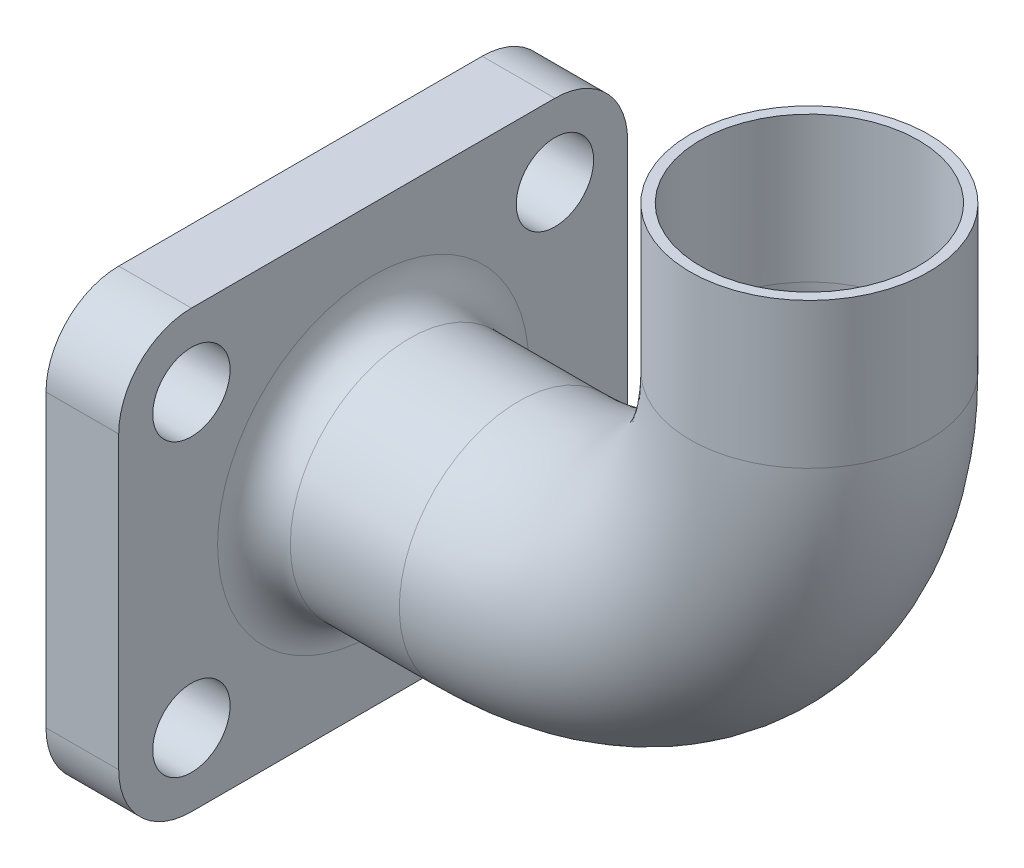
ISO-10303-21;
HEADER;
FILE_DESCRIPTION(('STEP AP214'),'2;1');
FILE_NAME('part.step','',(''),(''),'','','');
FILE_SCHEMA(('AUTOMOTIVE_DESIGN { 1 0 10303 214 1 1 1 1 }'));
ENDSEC;
DATA;
#1=APPLICATION_CONTEXT('core data for automotive mechanical design processes');
#2=APPLICATION_PROTOCOL_DEFINITION('international standard','automotive_design',2000,#1);
#3=PRODUCT_CONTEXT('',#1,'mechanical');
#4=PRODUCT('Part','Part','',(#3));
#5=PRODUCT_RELATED_PRODUCT_CATEGORY('part','',(#4));
#6=PRODUCT_DEFINITION_FORMATION('','',#4);
#7=PRODUCT_DEFINITION_CONTEXT('part definition',#1,'design');
#8=PRODUCT_DEFINITION('design','',#6,#7);
#9=PRODUCT_DEFINITION_SHAPE('','',#8);
#10=(LENGTH_UNIT() NAMED_UNIT(*) SI_UNIT(.MILLI.,.METRE.));
#11=(NAMED_UNIT(*) PLANE_ANGLE_UNIT() SI_UNIT($,.RADIAN.));
#12=(NAMED_UNIT(*) SI_UNIT($,.STERADIAN.) SOLID_ANGLE_UNIT());
#13=UNCERTAINTY_MEASURE_WITH_UNIT(LENGTH_MEASURE(1.E-05),#10,'distance_accuracy_value','');
#14=(GEOMETRIC_REPRESENTATION_CONTEXT(3) GLOBAL_UNCERTAINTY_ASSIGNED_CONTEXT((#13)) GLOBAL_UNIT_ASSIGNED_CONTEXT((#10,
#11,#12)) REPRESENTATION_CONTEXT('',''));
#15=CARTESIAN_POINT('',(0.,0.,0.));
#16=DIRECTION('',(0.,0.,1.));
#17=DIRECTION('',(1.,0.,0.));
#18=AXIS2_PLACEMENT_3D('',#15,#16,#17);
#19=CARTESIAN_POINT('',(6.35,-12.7,15.875));
#20=DIRECTION('',(-1.,0.,0.));
#21=DIRECTION('',(0.,0.,1.));
#22=AXIS2_PLACEMENT_3D('',#19,#20,#21);
#23=PLANE('',#22);
#24=CARTESIAN_POINT('',(6.35,-12.7,15.875));
#25=DIRECTION('',(1.,0.,0.));
#26=DIRECTION('',(0.,0.,-1.));
#27=AXIS2_PLACEMENT_3D('',#24,#25,#26);
#28=CIRCLE('',#27,3.37819999999999);
#29=CARTESIAN_POINT('',(6.35,-12.7,12.4968));
#30=VERTEX_POINT('',#29);
#31=EDGE_CURVE('E167',#30,#30,#28,.T.);
#32=ORIENTED_EDGE('',*,*,#31,.F.);
#33=EDGE_LOOP('',(#32));
#34=FACE_BOUND('',#33,.T.);
#35=CARTESIAN_POINT('',(6.35,0.,0.));
#36=DIRECTION('',(-1.,0.,0.));
#37=DIRECTION('',(0.,0.,1.));
#38=AXIS2_PLACEMENT_3D('',#35,#36,#37);
#39=CIRCLE('',#38,13.589);
#40=CARTESIAN_POINT('',(6.35,0.,13.589));
#41=VERTEX_POINT('',#40);
#42=EDGE_CURVE('E11',#41,#41,#39,.T.);
#43=ORIENTED_EDGE('',*,*,#42,.T.);
#44=EDGE_LOOP('',(#43));
#45=FACE_BOUND('',#44,.T.);
#46=CARTESIAN_POINT('',(6.35,-12.7,15.875));
#47=DIRECTION('',(1.,0.,0.));
#48=DIRECTION('',(0.,0.,1.));
#49=AXIS2_PLACEMENT_3D('',#46,#47,#48);
#50=CIRCLE('',#49,6.35);
#51=CARTESIAN_POINT('',(6.35,-12.7,22.225));
#52=VERTEX_POINT('',#51);
#53=CARTESIAN_POINT('',(6.35,-19.05,15.875));
#54=VERTEX_POINT('',#53);
#55=EDGE_CURVE('E149',#52,#54,#50,.T.);
#56=ORIENTED_EDGE('',*,*,#55,.T.);
#57=DIRECTION('',(0.,0.,-1.));
#58=VECTOR('',#57,1.);
#59=CARTESIAN_POINT('',(6.35,-19.05,15.875));
#60=LINE('',#59,#58);
#61=CARTESIAN_POINT('',(6.35,-19.05,-15.875));
#62=VERTEX_POINT('',#61);
#63=EDGE_CURVE('E97',#54,#62,#60,.T.);
#64=ORIENTED_EDGE('',*,*,#63,.T.);
#65=CARTESIAN_POINT('',(6.35,-12.7,-15.875));
#66=DIRECTION('',(1.,0.,0.));
#67=DIRECTION('',(0.,0.,-1.));
#68=AXIS2_PLACEMENT_3D('',#65,#66,#67);
#69=CIRCLE('',#68,6.35);
#70=CARTESIAN_POINT('',(6.35,-12.7,-22.225));
#71=VERTEX_POINT('',#70);
#72=EDGE_CURVE('E214',#62,#71,#69,.T.);
#73=ORIENTED_EDGE('',*,*,#72,.T.);
#74=DIRECTION('',(0.,1.,0.));
#75=VECTOR('',#74,1.);
#76=CARTESIAN_POINT('',(6.35,-12.7,-22.225));
#77=LINE('',#76,#75);
#78=CARTESIAN_POINT('',(6.35,12.7,-22.225));
#79=VERTEX_POINT('',#78);
#80=EDGE_CURVE('E216',#71,#79,#77,.T.);
#81=ORIENTED_EDGE('',*,*,#80,.T.);
#82=CARTESIAN_POINT('',(6.35,12.7,-15.875));
#83=DIRECTION('',(1.,0.,0.));
#84=DIRECTION('',(0.,0.,1.));
#85=AXIS2_PLACEMENT_3D('',#82,#83,#84);
#86=CIRCLE('',#85,6.35);
#87=CARTESIAN_POINT('',(6.35,19.05,-15.875));
#88=VERTEX_POINT('',#87);
#89=EDGE_CURVE('E116',#79,#88,#86,.T.);
#90=ORIENTED_EDGE('',*,*,#89,.T.);
#91=DIRECTION('',(0.,0.,1.));
#92=VECTOR('',#91,1.);
#93=CARTESIAN_POINT('',(6.35,19.05,15.875));
#94=LINE('',#93,#92);
#95=CARTESIAN_POINT('',(6.35,19.05,15.875));
#96=VERTEX_POINT('',#95);
#97=EDGE_CURVE('E110',#88,#96,#94,.T.);
#98=ORIENTED_EDGE('',*,*,#97,.T.);
#99=CARTESIAN_POINT('',(6.35,12.7,15.875));
#100=DIRECTION('',(1.,0.,0.));
#101=DIRECTION('',(0.,0.,1.));
#102=AXIS2_PLACEMENT_3D('',#99,#100,#101);
#103=CIRCLE('',#102,6.35);
#104=CARTESIAN_POINT('',(6.35,12.7,22.225));
#105=VERTEX_POINT('',#104);
#106=EDGE_CURVE('E114',#96,#105,#103,.T.);
#107=ORIENTED_EDGE('',*,*,#106,.T.);
#108=DIRECTION('',(0.,-1.,0.));
#109=VECTOR('',#108,1.);
#110=CARTESIAN_POINT('',(6.35,-12.7,22.225));
#111=LINE('',#110,#109);
#112=EDGE_CURVE('E53',#105,#52,#111,.T.);
#113=ORIENTED_EDGE('',*,*,#112,.T.);
#114=EDGE_LOOP('',(#56,#64,#73,#81,#90,#98,#107,#113));
#115=FACE_BOUND('',#114,.T.);
#116=CARTESIAN_POINT('',(6.35,-12.7,-15.875));
#117=DIRECTION('',(1.,0.,0.));
#118=DIRECTION('',(0.,0.,-1.));
#119=AXIS2_PLACEMENT_3D('',#116,#117,#118);
#120=CIRCLE('',#119,3.37819999999999);
#121=CARTESIAN_POINT('',(6.35,-12.7,-19.2532));
#122=VERTEX_POINT('',#121);
#123=EDGE_CURVE('E168',#122,#122,#120,.T.);
#124=ORIENTED_EDGE('',*,*,#123,.F.);
#125=EDGE_LOOP('',(#124));
#126=FACE_BOUND('',#125,.T.);
#127=CARTESIAN_POINT('',(6.35,12.7,-15.875));
#128=DIRECTION('',(1.,0.,0.));
#129=DIRECTION('',(0.,0.,-1.));
#130=AXIS2_PLACEMENT_3D('',#127,#128,#129);
#131=CIRCLE('',#130,3.37819999999999);
#132=CARTESIAN_POINT('',(6.35,12.7,-19.2532));
#133=VERTEX_POINT('',#132);
#134=EDGE_CURVE('E180',#133,#133,#131,.T.);
#135=ORIENTED_EDGE('',*,*,#134,.F.);
#136=EDGE_LOOP('',(#135));
#137=FACE_BOUND('',#136,.T.);
#138=CARTESIAN_POINT('',(6.35,12.7,15.875));
#139=DIRECTION('',(1.,0.,0.));
#140=DIRECTION('',(0.,0.,-1.));
#141=AXIS2_PLACEMENT_3D('',#138,#139,#140);
#142=CIRCLE('',#141,3.37819999999999);
#143=CARTESIAN_POINT('',(6.35,12.7,12.4968));
#144=VERTEX_POINT('',#143);
#145=EDGE_CURVE('E311',#144,#144,#142,.T.);
#146=ORIENTED_EDGE('',*,*,#145,.F.);
#147=EDGE_LOOP('',(#146));
#148=FACE_BOUND('',#147,.T.);
#149=ADVANCED_FACE('F34',(#34,#45,#115,#126,#137,#148),#23,.F.);
#150=CARTESIAN_POINT('',(0.,-12.7,15.875));
#151=DIRECTION('',(-1.,0.,0.));
#152=DIRECTION('',(0.,0.,1.));
#153=AXIS2_PLACEMENT_3D('',#150,#151,#152);
#154=PLANE('',#153);
#155=CARTESIAN_POINT('',(0.,12.7,15.875));
#156=DIRECTION('',(-1.,0.,0.));
#157=DIRECTION('',(0.,0.,1.));
#158=AXIS2_PLACEMENT_3D('',#155,#156,#157);
#159=CIRCLE('',#158,3.37819999999999);
#160=CARTESIAN_POINT('',(0.,12.7,19.2532));
#161=VERTEX_POINT('',#160);
#162=EDGE_CURVE('E38',#161,#161,#159,.T.);
#163=ORIENTED_EDGE('',*,*,#162,.F.);
#164=EDGE_LOOP('',(#163));
#165=FACE_BOUND('',#164,.T.);
#166=CARTESIAN_POINT('',(0.,12.7,-15.875));
#167=DIRECTION('',(-1.,0.,0.));
#168=DIRECTION('',(0.,0.,1.));
#169=AXIS2_PLACEMENT_3D('',#166,#167,#168);
#170=CIRCLE('',#169,3.37819999999999);
#171=CARTESIAN_POINT('',(0.,12.7,-12.4968));
#172=VERTEX_POINT('',#171);
#173=EDGE_CURVE('E175',#172,#172,#170,.T.);
#174=ORIENTED_EDGE('',*,*,#173,.F.);
#175=EDGE_LOOP('',(#174));
#176=FACE_BOUND('',#175,.T.);
#177=CARTESIAN_POINT('',(0.,-12.7,-15.875));
#178=DIRECTION('',(-1.,0.,0.));
#179=DIRECTION('',(0.,0.,1.));
#180=AXIS2_PLACEMENT_3D('',#177,#178,#179);
#181=CIRCLE('',#180,3.37819999999999);
#182=CARTESIAN_POINT('',(0.,-12.7,-12.4968));
#183=VERTEX_POINT('',#182);
#184=EDGE_CURVE('E165',#183,#183,#181,.T.);
#185=ORIENTED_EDGE('',*,*,#184,.F.);
#186=EDGE_LOOP('',(#185));
#187=FACE_BOUND('',#186,.T.);
#188=CARTESIAN_POINT('',(0.,-12.7,15.875));
#189=DIRECTION('',(-1.,0.,0.));
#190=DIRECTION('',(0.,0.,1.));
#191=AXIS2_PLACEMENT_3D('',#188,#189,#190);
#192=CIRCLE('',#191,3.37819999999999);
#193=CARTESIAN_POINT('',(0.,-12.7,19.2532));
#194=VERTEX_POINT('',#193);
#195=EDGE_CURVE('E172',#194,#194,#192,.T.);
#196=ORIENTED_EDGE('',*,*,#195,.F.);
#197=EDGE_LOOP('',(#196));
#198=FACE_BOUND('',#197,.T.);
#199=CARTESIAN_POINT('',(0.,-12.7,15.875));
#200=DIRECTION('',(1.,0.,0.));
#201=DIRECTION('',(0.,0.,1.));
#202=AXIS2_PLACEMENT_3D('',#199,#200,#201);
#203=CIRCLE('',#202,6.35);
#204=CARTESIAN_POINT('',(0.,-12.7,22.225));
#205=VERTEX_POINT('',#204);
#206=CARTESIAN_POINT('',(0.,-19.05,15.875));
#207=VERTEX_POINT('',#206);
#208=EDGE_CURVE('E134',#205,#207,#203,.T.);
#209=ORIENTED_EDGE('',*,*,#208,.F.);
#210=DIRECTION('',(0.,-1.,0.));
#211=VECTOR('',#210,1.);
#212=CARTESIAN_POINT('',(0.,-12.7,22.225));
#213=LINE('',#212,#211);
#214=CARTESIAN_POINT('',(0.,12.7,22.225));
#215=VERTEX_POINT('',#214);
#216=EDGE_CURVE('E88',#215,#205,#213,.T.);
#217=ORIENTED_EDGE('',*,*,#216,.F.);
#218=CARTESIAN_POINT('',(0.,12.7,15.875));
#219=DIRECTION('',(1.,0.,0.));
#220=DIRECTION('',(0.,0.,1.));
#221=AXIS2_PLACEMENT_3D('',#218,#219,#220);
#222=CIRCLE('',#221,6.35);
#223=CARTESIAN_POINT('',(0.,19.05,15.875));
#224=VERTEX_POINT('',#223);
#225=EDGE_CURVE('E82',#224,#215,#222,.T.);
#226=ORIENTED_EDGE('',*,*,#225,.F.);
#227=DIRECTION('',(0.,0.,1.));
#228=VECTOR('',#227,1.);
#229=CARTESIAN_POINT('',(0.,19.05,15.875));
#230=LINE('',#229,#228);
#231=CARTESIAN_POINT('',(0.,19.05,-15.875));
#232=VERTEX_POINT('',#231);
#233=EDGE_CURVE('E124',#232,#224,#230,.T.);
#234=ORIENTED_EDGE('',*,*,#233,.F.);
#235=CARTESIAN_POINT('',(0.,12.7,-15.875));
#236=DIRECTION('',(1.,0.,0.));
#237=DIRECTION('',(0.,0.,1.));
#238=AXIS2_PLACEMENT_3D('',#235,#236,#237);
#239=CIRCLE('',#238,6.35);
#240=CARTESIAN_POINT('',(0.,12.7,-22.225));
#241=VERTEX_POINT('',#240);
#242=EDGE_CURVE('E144',#241,#232,#239,.T.);
#243=ORIENTED_EDGE('',*,*,#242,.F.);
#244=DIRECTION('',(0.,1.,0.));
#245=VECTOR('',#244,1.);
#246=CARTESIAN_POINT('',(0.,-12.7,-22.225));
#247=LINE('',#246,#245);
#248=CARTESIAN_POINT('',(0.,-12.7,-22.225));
#249=VERTEX_POINT('',#248);
#250=EDGE_CURVE('E142',#249,#241,#247,.T.);
#251=ORIENTED_EDGE('',*,*,#250,.F.);
#252=CARTESIAN_POINT('',(0.,-12.7,-15.875));
#253=DIRECTION('',(1.,0.,0.));
#254=DIRECTION('',(0.,0.,-1.));
#255=AXIS2_PLACEMENT_3D('',#252,#253,#254);
#256=CIRCLE('',#255,6.35);
#257=CARTESIAN_POINT('',(0.,-19.05,-15.875));
#258=VERTEX_POINT('',#257);
#259=EDGE_CURVE('E140',#258,#249,#256,.T.);
#260=ORIENTED_EDGE('',*,*,#259,.F.);
#261=DIRECTION('',(0.,0.,-1.));
#262=VECTOR('',#261,1.);
#263=CARTESIAN_POINT('',(0.,-19.05,15.875));
#264=LINE('',#263,#262);
#265=EDGE_CURVE('E137',#207,#258,#264,.T.);
#266=ORIENTED_EDGE('',*,*,#265,.F.);
#267=EDGE_LOOP('',(#209,#217,#226,#234,#243,#251,#260,#266));
#268=FACE_BOUND('',#267,.T.);
#269=CARTESIAN_POINT('',(0.,0.,0.));
#270=DIRECTION('',(-1.,0.,0.));
#271=DIRECTION('',(0.,0.,1.));
#272=AXIS2_PLACEMENT_3D('',#269,#270,#271);
#273=CIRCLE('',#272,12.7);
#274=CARTESIAN_POINT('',(0.,0.,12.7));
#275=VERTEX_POINT('',#274);
#276=EDGE_CURVE('E189',#275,#275,#273,.T.);
#277=ORIENTED_EDGE('',*,*,#276,.F.);
#278=EDGE_LOOP('',(#277));
#279=FACE_BOUND('',#278,.T.);
#280=ADVANCED_FACE('F229',(#165,#176,#187,#198,#268,#279),#154,.T.);
#281=CARTESIAN_POINT('',(6.35,-12.7,15.875));
#282=DIRECTION('',(-1.,0.,0.));
#283=DIRECTION('',(0.,0.,1.));
#284=AXIS2_PLACEMENT_3D('',#281,#282,#283);
#285=CYLINDRICAL_SURFACE('',#284,6.35);
#286=ORIENTED_EDGE('',*,*,#208,.T.);
#287=DIRECTION('',(-1.,0.,0.));
#288=VECTOR('',#287,1.);
#289=CARTESIAN_POINT('',(6.35,-19.05,15.875));
#290=LINE('',#289,#288);
#291=EDGE_CURVE('E162',#54,#207,#290,.T.);
#292=ORIENTED_EDGE('',*,*,#291,.F.);
#293=ORIENTED_EDGE('',*,*,#55,.F.);
#294=DIRECTION('',(-1.,0.,0.));
#295=VECTOR('',#294,1.);
#296=CARTESIAN_POINT('',(6.35,-12.7,22.225));
#297=LINE('',#296,#295);
#298=EDGE_CURVE('E130',#52,#205,#297,.T.);
#299=ORIENTED_EDGE('',*,*,#298,.T.);
#300=EDGE_LOOP('',(#286,#292,#293,#299));
#301=FACE_BOUND('',#300,.T.);
#302=ADVANCED_FACE('F234',(#301),#285,.T.);
#303=CARTESIAN_POINT('',(6.35,-19.05,15.875));
#304=DIRECTION('',(0.,1.,0.));
#305=DIRECTION('',(0.,0.,1.));
#306=AXIS2_PLACEMENT_3D('',#303,#304,#305);
#307=PLANE('',#306);
#308=ORIENTED_EDGE('',*,*,#265,.T.);
#309=DIRECTION('',(-1.,0.,0.));
#310=VECTOR('',#309,1.);
#311=CARTESIAN_POINT('',(6.35,-19.05,-15.875));
#312=LINE('',#311,#310);
#313=EDGE_CURVE('E159',#62,#258,#312,.T.);
#314=ORIENTED_EDGE('',*,*,#313,.F.);
#315=ORIENTED_EDGE('',*,*,#63,.F.);
#316=ORIENTED_EDGE('',*,*,#291,.T.);
#317=EDGE_LOOP('',(#308,#314,#315,#316));
#318=FACE_BOUND('',#317,.T.);
#319=ADVANCED_FACE('F414',(#318),#307,.F.);
#320=CARTESIAN_POINT('',(6.35,-12.7,-15.875));
#321=DIRECTION('',(-1.,0.,0.));
#322=DIRECTION('',(0.,0.,1.));
#323=AXIS2_PLACEMENT_3D('',#320,#321,#322);
#324=CYLINDRICAL_SURFACE('',#323,6.35);
#325=ORIENTED_EDGE('',*,*,#259,.T.);
#326=DIRECTION('',(-1.,0.,0.));
#327=VECTOR('',#326,1.);
#328=CARTESIAN_POINT('',(6.35,-12.7,-22.225));
#329=LINE('',#328,#327);
#330=EDGE_CURVE('E156',#71,#249,#329,.T.);
#331=ORIENTED_EDGE('',*,*,#330,.F.);
#332=ORIENTED_EDGE('',*,*,#72,.F.);
#333=ORIENTED_EDGE('',*,*,#313,.T.);
#334=EDGE_LOOP('',(#325,#331,#332,#333));
#335=FACE_BOUND('',#334,.T.);
#336=ADVANCED_FACE('F420',(#335),#324,.T.);
#337=CARTESIAN_POINT('',(6.35,-12.7,-22.225));
#338=DIRECTION('',(0.,0.,1.));
#339=DIRECTION('',(1.,0.,0.));
#340=AXIS2_PLACEMENT_3D('',#337,#338,#339);
#341=PLANE('',#340);
#342=ORIENTED_EDGE('',*,*,#250,.T.);
#343=DIRECTION('',(-1.,0.,0.));
#344=VECTOR('',#343,1.);
#345=CARTESIAN_POINT('',(6.35,12.7,-22.225));
#346=LINE('',#345,#344);
#347=EDGE_CURVE('E153',#79,#241,#346,.T.);
#348=ORIENTED_EDGE('',*,*,#347,.F.);
#349=ORIENTED_EDGE('',*,*,#80,.F.);
#350=ORIENTED_EDGE('',*,*,#330,.T.);
#351=EDGE_LOOP('',(#342,#348,#349,#350));
#352=FACE_BOUND('',#351,.T.);
#353=ADVANCED_FACE('F222',(#352),#341,.F.);
#354=CARTESIAN_POINT('',(6.35,12.7,-15.875));
#355=DIRECTION('',(-1.,0.,0.));
#356=DIRECTION('',(0.,0.,1.));
#357=AXIS2_PLACEMENT_3D('',#354,#355,#356);
#358=CYLINDRICAL_SURFACE('',#357,6.35);
#359=ORIENTED_EDGE('',*,*,#242,.T.);
#360=DIRECTION('',(-1.,0.,0.));
#361=VECTOR('',#360,1.);
#362=CARTESIAN_POINT('',(6.35,19.05,-15.875));
#363=LINE('',#362,#361);
#364=EDGE_CURVE('E125',#88,#232,#363,.T.);
#365=ORIENTED_EDGE('',*,*,#364,.F.);
#366=ORIENTED_EDGE('',*,*,#89,.F.);
#367=ORIENTED_EDGE('',*,*,#347,.T.);
#368=EDGE_LOOP('',(#359,#365,#366,#367));
#369=FACE_BOUND('',#368,.T.);
#370=ADVANCED_FACE('F226',(#369),#358,.T.);
#371=CARTESIAN_POINT('',(6.35,19.05,15.875));
#372=DIRECTION('',(0.,-1.,0.));
#373=DIRECTION('',(0.,0.,-1.));
#374=AXIS2_PLACEMENT_3D('',#371,#372,#373);
#375=PLANE('',#374);
#376=ORIENTED_EDGE('',*,*,#233,.T.);
#377=DIRECTION('',(-1.,0.,0.));
#378=VECTOR('',#377,1.);
#379=CARTESIAN_POINT('',(6.35,19.05,15.875));
#380=LINE('',#379,#378);
#381=EDGE_CURVE('E121',#96,#224,#380,.T.);
#382=ORIENTED_EDGE('',*,*,#381,.F.);
#383=ORIENTED_EDGE('',*,*,#97,.F.);
#384=ORIENTED_EDGE('',*,*,#364,.T.);
#385=EDGE_LOOP('',(#376,#382,#383,#384));
#386=FACE_BOUND('',#385,.T.);
#387=ADVANCED_FACE('F122',(#386),#375,.F.);
#388=CARTESIAN_POINT('',(6.35,12.7,15.875));
#389=DIRECTION('',(-1.,0.,0.));
#390=DIRECTION('',(0.,0.,1.));
#391=AXIS2_PLACEMENT_3D('',#388,#389,#390);
#392=CYLINDRICAL_SURFACE('',#391,6.35);
#393=ORIENTED_EDGE('',*,*,#225,.T.);
#394=DIRECTION('',(-1.,0.,0.));
#395=VECTOR('',#394,1.);
#396=CARTESIAN_POINT('',(6.35,12.7,22.225));
#397=LINE('',#396,#395);
#398=EDGE_CURVE('E126',#105,#215,#397,.T.);
#399=ORIENTED_EDGE('',*,*,#398,.F.);
#400=ORIENTED_EDGE('',*,*,#106,.F.);
#401=ORIENTED_EDGE('',*,*,#381,.T.);
#402=EDGE_LOOP('',(#393,#399,#400,#401));
#403=FACE_BOUND('',#402,.T.);
#404=ADVANCED_FACE('F128',(#403),#392,.T.);
#405=CARTESIAN_POINT('',(6.35,-12.7,22.225));
#406=DIRECTION('',(0.,0.,-1.));
#407=DIRECTION('',(-1.,0.,0.));
#408=AXIS2_PLACEMENT_3D('',#405,#406,#407);
#409=PLANE('',#408);
#410=ORIENTED_EDGE('',*,*,#216,.T.);
#411=ORIENTED_EDGE('',*,*,#298,.F.);
#412=ORIENTED_EDGE('',*,*,#112,.F.);
#413=ORIENTED_EDGE('',*,*,#398,.T.);
#414=EDGE_LOOP('',(#410,#411,#412,#413));
#415=FACE_BOUND('',#414,.T.);
#416=ADVANCED_FACE('F236',(#415),#409,.F.);
#417=CARTESIAN_POINT('',(6.35,0.,0.));
#418=DIRECTION('',(-1.,0.,0.));
#419=DIRECTION('',(0.,0.,1.));
#420=AXIS2_PLACEMENT_3D('',#417,#418,#419);
#421=CYLINDRICAL_SURFACE('',#420,9.525);
#422=CARTESIAN_POINT('',(19.05,0.,0.));
#423=DIRECTION('',(1.,0.,0.));
#424=DIRECTION('',(0.,0.,-1.));
#425=AXIS2_PLACEMENT_3D('',#422,#423,#424);
#426=CIRCLE('',#425,9.525);
#427=CARTESIAN_POINT('',(19.05,-9.52500000000001,0.));
#428=VERTEX_POINT('',#427);
#429=EDGE_CURVE('E193',#428,#428,#426,.T.);
#430=ORIENTED_EDGE('',*,*,#429,.T.);
#431=EDGE_LOOP('',(#430));
#432=FACE_BOUND('',#431,.T.);
#433=CARTESIAN_POINT('',(-2.921,0.,0.));
#434=DIRECTION('',(-1.,0.,0.));
#435=DIRECTION('',(0.,0.,1.));
#436=AXIS2_PLACEMENT_3D('',#433,#434,#435);
#437=CIRCLE('',#436,9.525);
#438=CARTESIAN_POINT('',(-2.921,0.,9.525));
#439=VERTEX_POINT('',#438);
#440=EDGE_CURVE('E186',#439,#439,#437,.T.);
#441=ORIENTED_EDGE('',*,*,#440,.T.);
#442=EDGE_LOOP('',(#441));
#443=FACE_BOUND('',#442,.T.);
#444=ADVANCED_FACE('F238',(#432,#443),#421,.F.);
#445=CARTESIAN_POINT('',(44.45,25.4,0.));
#446=DIRECTION('',(0.,1.,0.));
#447=DIRECTION('',(-1.,0.,0.));
#448=AXIS2_PLACEMENT_3D('',#445,#446,#447);
#449=CYLINDRICAL_SURFACE('',#448,10.414);
#450=CARTESIAN_POINT('',(44.45,25.4,0.));
#451=DIRECTION('',(0.,1.,0.));
#452=DIRECTION('',(-1.,0.,0.));
#453=AXIS2_PLACEMENT_3D('',#450,#451,#452);
#454=CIRCLE('',#453,10.414);
#455=CARTESIAN_POINT('',(54.864,25.4,0.));
#456=VERTEX_POINT('',#455);
#457=EDGE_CURVE('E205',#456,#456,#454,.T.);
#458=ORIENTED_EDGE('',*,*,#457,.T.);
#459=EDGE_LOOP('',(#458));
#460=FACE_BOUND('',#459,.T.);
#461=CARTESIAN_POINT('',(44.45,38.1,0.));
#462=DIRECTION('',(0.,1.,0.));
#463=DIRECTION('',(-1.,0.,0.));
#464=AXIS2_PLACEMENT_3D('',#461,#462,#463);
#465=CIRCLE('',#464,10.414);
#466=CARTESIAN_POINT('',(34.036,38.1,0.));
#467=VERTEX_POINT('',#466);
#468=EDGE_CURVE('E138',#467,#467,#465,.T.);
#469=ORIENTED_EDGE('',*,*,#468,.F.);
#470=EDGE_LOOP('',(#469));
#471=FACE_BOUND('',#470,.T.);
#472=ADVANCED_FACE('F244',(#460,#471),#449,.T.);
#473=CARTESIAN_POINT('',(19.05,25.4,0.));
#474=DIRECTION('',(0.,0.,1.));
#475=DIRECTION('',(1.,0.,0.));
#476=AXIS2_PLACEMENT_3D('',#473,#474,#475);
#477=TOROIDAL_SURFACE('',#476,25.4,10.414);
#478=CARTESIAN_POINT('',(19.05,0.,0.));
#479=DIRECTION('',(-1.,0.,0.));
#480=DIRECTION('',(0.,-1.,0.));
#481=AXIS2_PLACEMENT_3D('',#478,#479,#480);
#482=CIRCLE('',#481,10.414);
#483=CARTESIAN_POINT('',(19.05,-10.414,0.));
#484=VERTEX_POINT('',#483);
#485=EDGE_CURVE('E204',#484,#484,#482,.F.);
#486=CARTESIAN_POINT('',(19.05,25.4,0.));
#487=DIRECTION('',(0.,0.,1.));
#488=DIRECTION('',(1.,0.,0.));
#489=AXIS2_PLACEMENT_3D('',#486,#487,#488);
#490=CIRCLE('',#489,35.814);
#491=EDGE_CURVE('',#484,#456,#490,.T.);
#492=ORIENTED_EDGE('',*,*,#485,.T.);
#493=ORIENTED_EDGE('',*,*,#457,.F.);
#494=ORIENTED_EDGE('',*,*,#491,.T.);
#495=ORIENTED_EDGE('',*,*,#491,.F.);
#496=EDGE_LOOP('',(#492,#494,#493,#495));
#497=FACE_BOUND('',#496,.T.);
#498=ADVANCED_FACE('F263',(#497),#477,.T.);
#499=CARTESIAN_POINT('',(19.05,0.,0.));
#500=DIRECTION('',(-1.,0.,0.));
#501=DIRECTION('',(0.,-1.,0.));
#502=AXIS2_PLACEMENT_3D('',#499,#500,#501);
#503=CYLINDRICAL_SURFACE('',#502,10.414);
#504=CARTESIAN_POINT('',(9.525,0.,0.));
#505=DIRECTION('',(-1.,0.,0.));
#506=DIRECTION('',(0.,0.,1.));
#507=AXIS2_PLACEMENT_3D('',#504,#505,#506);
#508=CIRCLE('',#507,10.414);
#509=CARTESIAN_POINT('',(9.525,-10.414,0.));
#510=VERTEX_POINT('',#509);
#511=EDGE_CURVE('E44',#510,#510,#508,.F.);
#512=CARTESIAN_POINT('',(9.525,-10.414,0.));
#513=CARTESIAN_POINT('',(9.62421875,-10.414,0.));
#514=CARTESIAN_POINT('',(9.7234375,-10.414,0.));
#515=CARTESIAN_POINT('',(9.921875,-10.414,0.));
#516=CARTESIAN_POINT('',(10.02109375,-10.414,0.));
#517=CARTESIAN_POINT('',(10.21953125,-10.414,0.));
#518=CARTESIAN_POINT('',(10.31875,-10.414,0.));
#519=CARTESIAN_POINT('',(10.5171875,-10.414,0.));
#520=CARTESIAN_POINT('',(10.61640625,-10.414,0.));
#521=CARTESIAN_POINT('',(10.81484375,-10.414,0.));
#522=CARTESIAN_POINT('',(10.9140625,-10.414,0.));
#523=CARTESIAN_POINT('',(11.1125,-10.414,0.));
#524=CARTESIAN_POINT('',(11.21171875,-10.414,0.));
#525=CARTESIAN_POINT('',(11.41015625,-10.414,0.));
#526=CARTESIAN_POINT('',(11.509375,-10.414,0.));
#527=CARTESIAN_POINT('',(11.7078125,-10.414,0.));
#528=CARTESIAN_POINT('',(11.80703125,-10.414,0.));
#529=CARTESIAN_POINT('',(12.00546875,-10.414,0.));
#530=CARTESIAN_POINT('',(12.1046875,-10.414,0.));
#531=CARTESIAN_POINT('',(12.303125,-10.414,0.));
#532=CARTESIAN_POINT('',(12.40234375,-10.414,0.));
#533=CARTESIAN_POINT('',(12.60078125,-10.414,0.));
#534=CARTESIAN_POINT('',(12.7,-10.414,0.));
#535=CARTESIAN_POINT('',(12.8984375,-10.414,0.));
#536=CARTESIAN_POINT('',(12.99765625,-10.414,0.));
#537=CARTESIAN_POINT('',(13.19609375,-10.414,0.));
#538=CARTESIAN_POINT('',(13.2953125,-10.414,0.));
#539=CARTESIAN_POINT('',(13.49375,-10.414,0.));
#540=CARTESIAN_POINT('',(13.59296875,-10.414,0.));
#541=CARTESIAN_POINT('',(13.79140625,-10.414,0.));
#542=CARTESIAN_POINT('',(13.890625,-10.414,0.));
#543=CARTESIAN_POINT('',(14.0890625,-10.414,0.));
#544=CARTESIAN_POINT('',(14.18828125,-10.414,0.));
#545=CARTESIAN_POINT('',(14.38671875,-10.414,0.));
#546=CARTESIAN_POINT('',(14.4859375,-10.414,0.));
#547=CARTESIAN_POINT('',(14.684375,-10.414,0.));
#548=CARTESIAN_POINT('',(14.78359375,-10.414,0.));
#549=CARTESIAN_POINT('',(14.98203125,-10.414,0.));
#550=CARTESIAN_POINT('',(15.08125,-10.414,0.));
#551=CARTESIAN_POINT('',(15.2796875,-10.414,0.));
#552=CARTESIAN_POINT('',(15.37890625,-10.414,0.));
#553=CARTESIAN_POINT('',(15.57734375,-10.414,0.));
#554=CARTESIAN_POINT('',(15.6765625,-10.414,0.));
#555=CARTESIAN_POINT('',(15.875,-10.414,0.));
#556=CARTESIAN_POINT('',(15.97421875,-10.414,0.));
#557=CARTESIAN_POINT('',(16.17265625,-10.414,0.));
#558=CARTESIAN_POINT('',(16.271875,-10.414,0.));
#559=CARTESIAN_POINT('',(16.4703125,-10.414,0.));
#560=CARTESIAN_POINT('',(16.56953125,-10.414,0.));
#561=CARTESIAN_POINT('',(16.76796875,-10.414,0.));
#562=CARTESIAN_POINT('',(16.8671875,-10.414,0.));
#563=CARTESIAN_POINT('',(17.065625,-10.414,0.));
#564=CARTESIAN_POINT('',(17.16484375,-10.414,0.));
#565=CARTESIAN_POINT('',(17.36328125,-10.414,0.));
#566=CARTESIAN_POINT('',(17.4625,-10.414,0.));
#567=CARTESIAN_POINT('',(17.6609375,-10.414,0.));
#568=CARTESIAN_POINT('',(17.76015625,-10.414,0.));
#569=CARTESIAN_POINT('',(17.95859375,-10.414,0.));
#570=CARTESIAN_POINT('',(18.0578125,-10.414,0.));
#571=CARTESIAN_POINT('',(18.25625,-10.414,0.));
#572=CARTESIAN_POINT('',(18.35546875,-10.414,0.));
#573=CARTESIAN_POINT('',(18.55390625,-10.414,0.));
#574=CARTESIAN_POINT('',(18.653125,-10.414,0.));
#575=CARTESIAN_POINT('',(18.8515625,-10.414,0.));
#576=CARTESIAN_POINT('',(18.95078125,-10.414,0.));
#577=CARTESIAN_POINT('',(19.05,-10.414,0.));
#578=B_SPLINE_CURVE_WITH_KNOTS('',3,(#512,#513,#514,#515,#516,#517,#518,#519,#520,#521,#522,
#523,#524,#525,#526,#527,#528,#529,#530,#531,#532,#533,#534,#535,#536,#537,#538,#539,#540,#541,
#542,#543,#544,#545,#546,#547,#548,#549,#550,#551,#552,#553,#554,#555,#556,#557,#558,#559,#560,
#561,#562,#563,#564,#565,#566,#567,#568,#569,#570,#571,#572,#573,#574,#575,#576,#577),
.UNSPECIFIED.,.F.,.F.,(4,2,2,2,2,2,2,2,2,2,2,2,2,2,2,2,2,2,2,2,2,2,2,2,2,2,2,2,2,2,2,2,4),(0.,
0.29765625,0.5953125,0.892968750000001,1.190625,1.48828125,1.7859375,2.08359375,2.38125,
2.67890625,2.9765625,3.27421875,3.571875,3.86953125,4.1671875,4.46484375,4.7625,5.06015625,
5.3578125,5.65546875,5.953125,6.25078125,6.5484375,6.84609375,7.14375,7.44140625,7.7390625,
8.03671875,8.334375,8.63203125,8.9296875,9.22734375,9.525),.UNSPECIFIED.);
#579=EDGE_CURVE('BSEAM259',#510,#484,#578,.T.);
#580=ORIENTED_EDGE('',*,*,#511,.T.);
#581=ORIENTED_EDGE('',*,*,#485,.F.);
#582=ORIENTED_EDGE('',*,*,#579,.T.);
#583=ORIENTED_EDGE('',*,*,#579,.F.);
#584=EDGE_LOOP('',(#580,#582,#581,#583));
#585=FACE_BOUND('',#584,.T.);
#586=ADVANCED_FACE('F259',(#585),#503,.T.);
#587=CARTESIAN_POINT('',(44.45,38.1,0.));
#588=DIRECTION('',(0.,1.,0.));
#589=DIRECTION('',(0.,0.,-1.));
#590=AXIS2_PLACEMENT_3D('',#587,#588,#589);
#591=PLANE('',#590);
#592=CARTESIAN_POINT('',(44.45,38.1,0.));
#593=DIRECTION('',(0.,1.,0.));
#594=DIRECTION('',(0.,0.,-1.));
#595=AXIS2_PLACEMENT_3D('',#592,#593,#594);
#596=CIRCLE('',#595,9.525);
#597=CARTESIAN_POINT('',(44.45,38.1,-9.525));
#598=VERTEX_POINT('',#597);
#599=EDGE_CURVE('E201',#598,#598,#596,.T.);
#600=ORIENTED_EDGE('',*,*,#599,.F.);
#601=EDGE_LOOP('',(#600));
#602=FACE_BOUND('',#601,.T.);
#603=ORIENTED_EDGE('',*,*,#468,.T.);
#604=EDGE_LOOP('',(#603));
#605=FACE_BOUND('',#604,.T.);
#606=ADVANCED_FACE('F262',(#602,#605),#591,.T.);
#607=CARTESIAN_POINT('',(44.45,25.4,0.));
#608=DIRECTION('',(0.,1.,0.));
#609=DIRECTION('',(-1.,0.,0.));
#610=AXIS2_PLACEMENT_3D('',#607,#608,#609);
#611=CYLINDRICAL_SURFACE('',#610,9.525);
#612=CARTESIAN_POINT('',(44.45,25.4,0.));
#613=DIRECTION('',(0.,1.,0.));
#614=DIRECTION('',(0.,0.,-1.));
#615=AXIS2_PLACEMENT_3D('',#612,#613,#614);
#616=CIRCLE('',#615,9.525);
#617=CARTESIAN_POINT('',(53.975,25.4,0.));
#618=VERTEX_POINT('',#617);
#619=EDGE_CURVE('E198',#618,#618,#616,.T.);
#620=ORIENTED_EDGE('',*,*,#619,.F.);
#621=EDGE_LOOP('',(#620));
#622=FACE_BOUND('',#621,.T.);
#623=ORIENTED_EDGE('',*,*,#599,.T.);
#624=EDGE_LOOP('',(#623));
#625=FACE_BOUND('',#624,.T.);
#626=ADVANCED_FACE('F273',(#622,#625),#611,.F.);
#627=CARTESIAN_POINT('',(19.05,25.4,0.));
#628=DIRECTION('',(0.,0.,1.));
#629=DIRECTION('',(1.,0.,0.));
#630=AXIS2_PLACEMENT_3D('',#627,#628,#629);
#631=TOROIDAL_SURFACE('',#630,25.4,9.525);
#632=CARTESIAN_POINT('',(19.05,25.4,0.));
#633=DIRECTION('',(0.,0.,1.));
#634=DIRECTION('',(1.,0.,0.));
#635=AXIS2_PLACEMENT_3D('',#632,#633,#634);
#636=CIRCLE('',#635,34.925);
#637=EDGE_CURVE('',#428,#618,#636,.T.);
#638=ORIENTED_EDGE('',*,*,#429,.F.);
#639=ORIENTED_EDGE('',*,*,#619,.T.);
#640=ORIENTED_EDGE('',*,*,#637,.T.);
#641=ORIENTED_EDGE('',*,*,#637,.F.);
#642=EDGE_LOOP('',(#638,#640,#639,#641));
#643=FACE_BOUND('',#642,.T.);
#644=ADVANCED_FACE('F277',(#643),#631,.F.);
#645=CARTESIAN_POINT('',(-2.921,0.,0.));
#646=DIRECTION('',(-1.,0.,0.));
#647=DIRECTION('',(0.,0.,1.));
#648=AXIS2_PLACEMENT_3D('',#645,#646,#647);
#649=PLANE('',#648);
#650=CARTESIAN_POINT('',(-2.921,0.,0.));
#651=DIRECTION('',(-1.,0.,0.));
#652=DIRECTION('',(0.,0.,1.));
#653=AXIS2_PLACEMENT_3D('',#650,#651,#652);
#654=CIRCLE('',#653,12.7);
#655=CARTESIAN_POINT('',(-2.921,0.,12.7));
#656=VERTEX_POINT('',#655);
#657=EDGE_CURVE('E190',#656,#656,#654,.T.);
#658=ORIENTED_EDGE('',*,*,#657,.T.);
#659=EDGE_LOOP('',(#658));
#660=FACE_BOUND('',#659,.T.);
#661=ORIENTED_EDGE('',*,*,#440,.F.);
#662=EDGE_LOOP('',(#661));
#663=FACE_BOUND('',#662,.T.);
#664=ADVANCED_FACE('F281',(#660,#663),#649,.T.);
#665=CARTESIAN_POINT('',(-2.921,0.,0.));
#666=DIRECTION('',(1.,0.,0.));
#667=DIRECTION('',(0.,0.,-1.));
#668=AXIS2_PLACEMENT_3D('',#665,#666,#667);
#669=CYLINDRICAL_SURFACE('',#668,12.7);
#670=ORIENTED_EDGE('',*,*,#657,.F.);
#671=EDGE_LOOP('',(#670));
#672=FACE_BOUND('',#671,.T.);
#673=ORIENTED_EDGE('',*,*,#276,.T.);
#674=EDGE_LOOP('',(#673));
#675=FACE_BOUND('',#674,.T.);
#676=ADVANCED_FACE('F283',(#672,#675),#669,.T.);
#677=CARTESIAN_POINT('',(9.525,0.,0.));
#678=DIRECTION('',(-1.,0.,0.));
#679=DIRECTION('',(0.,0.,1.));
#680=AXIS2_PLACEMENT_3D('',#677,#678,#679);
#681=TOROIDAL_SURFACE('',#680,13.589,3.175);
#682=ORIENTED_EDGE('',*,*,#42,.F.);
#683=EDGE_LOOP('',(#682));
#684=FACE_BOUND('',#683,.T.);
#685=ORIENTED_EDGE('',*,*,#511,.F.);
#686=EDGE_LOOP('',(#685));
#687=FACE_BOUND('',#686,.T.);
#688=ADVANCED_FACE('F36',(#684,#687),#681,.F.);
#689=CARTESIAN_POINT('',(6.35,-12.7,15.875));
#690=DIRECTION('',(1.,0.,0.));
#691=DIRECTION('',(0.,0.,-1.));
#692=AXIS2_PLACEMENT_3D('',#689,#690,#691);
#693=CYLINDRICAL_SURFACE('',#692,3.37819999999999);
#694=ORIENTED_EDGE('',*,*,#195,.T.);
#695=EDGE_LOOP('',(#694));
#696=FACE_BOUND('',#695,.T.);
#697=ORIENTED_EDGE('',*,*,#31,.T.);
#698=EDGE_LOOP('',(#697));
#699=FACE_BOUND('',#698,.T.);
#700=ADVANCED_FACE('F290',(#696,#699),#693,.F.);
#701=CARTESIAN_POINT('',(6.35,-12.7,-15.875));
#702=DIRECTION('',(1.,0.,0.));
#703=DIRECTION('',(0.,0.,-1.));
#704=AXIS2_PLACEMENT_3D('',#701,#702,#703);
#705=CYLINDRICAL_SURFACE('',#704,3.37819999999999);
#706=ORIENTED_EDGE('',*,*,#184,.T.);
#707=EDGE_LOOP('',(#706));
#708=FACE_BOUND('',#707,.T.);
#709=ORIENTED_EDGE('',*,*,#123,.T.);
#710=EDGE_LOOP('',(#709));
#711=FACE_BOUND('',#710,.T.);
#712=ADVANCED_FACE('F293',(#708,#711),#705,.F.);
#713=CARTESIAN_POINT('',(6.35,12.7,-15.875));
#714=DIRECTION('',(1.,0.,0.));
#715=DIRECTION('',(0.,0.,-1.));
#716=AXIS2_PLACEMENT_3D('',#713,#714,#715);
#717=CYLINDRICAL_SURFACE('',#716,3.37819999999999);
#718=ORIENTED_EDGE('',*,*,#173,.T.);
#719=EDGE_LOOP('',(#718));
#720=FACE_BOUND('',#719,.T.);
#721=ORIENTED_EDGE('',*,*,#134,.T.);
#722=EDGE_LOOP('',(#721));
#723=FACE_BOUND('',#722,.T.);
#724=ADVANCED_FACE('F297',(#720,#723),#717,.F.);
#725=CARTESIAN_POINT('',(6.35,12.7,15.875));
#726=DIRECTION('',(1.,0.,0.));
#727=DIRECTION('',(0.,0.,-1.));
#728=AXIS2_PLACEMENT_3D('',#725,#726,#727);
#729=CYLINDRICAL_SURFACE('',#728,3.37819999999999);
#730=ORIENTED_EDGE('',*,*,#162,.T.);
#731=EDGE_LOOP('',(#730));
#732=FACE_BOUND('',#731,.T.);
#733=ORIENTED_EDGE('',*,*,#145,.T.);
#734=EDGE_LOOP('',(#733));
#735=FACE_BOUND('',#734,.T.);
#736=ADVANCED_FACE('F300',(#732,#735),#729,.F.);
#737=CLOSED_SHELL('',(#149,#280,#302,#319,#336,#353,#370,#387,#404,#416,#444,#472,#498,#586,
#606,#626,#644,#664,#676,#688,#700,#712,#724,#736));
#738=MANIFOLD_SOLID_BREP('B2',#737);
#739=ADVANCED_BREP_SHAPE_REPRESENTATION('',(#18,#738),#14);
#740=SHAPE_DEFINITION_REPRESENTATION(#9,#739);
ENDSEC;
END-ISO-10303-21;
